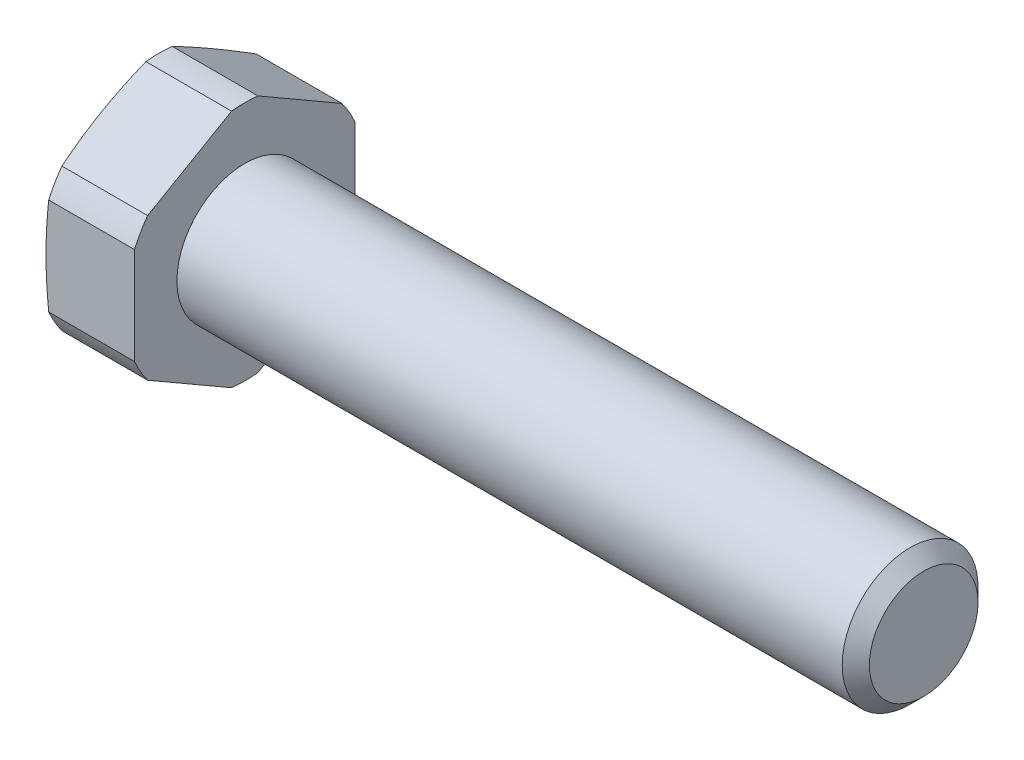
ISO-10303-21;
HEADER;
FILE_DESCRIPTION(('STEP AP214'),'2;1');
FILE_NAME('part.step','',(''),(''),'','','');
FILE_SCHEMA(('AUTOMOTIVE_DESIGN { 1 0 10303 214 1 1 1 1 }'));
ENDSEC;
DATA;
#1=APPLICATION_CONTEXT('core data for automotive mechanical design processes');
#2=APPLICATION_PROTOCOL_DEFINITION('international standard','automotive_design',2000,#1);
#3=PRODUCT_CONTEXT('',#1,'mechanical');
#4=PRODUCT('Part','Part','',(#3));
#5=PRODUCT_RELATED_PRODUCT_CATEGORY('part','',(#4));
#6=PRODUCT_DEFINITION_FORMATION('','',#4);
#7=PRODUCT_DEFINITION_CONTEXT('part definition',#1,'design');
#8=PRODUCT_DEFINITION('design','',#6,#7);
#9=PRODUCT_DEFINITION_SHAPE('','',#8);
#10=(LENGTH_UNIT() NAMED_UNIT(*) SI_UNIT(.MILLI.,.METRE.));
#11=(NAMED_UNIT(*) PLANE_ANGLE_UNIT() SI_UNIT($,.RADIAN.));
#12=(NAMED_UNIT(*) SI_UNIT($,.STERADIAN.) SOLID_ANGLE_UNIT());
#13=UNCERTAINTY_MEASURE_WITH_UNIT(LENGTH_MEASURE(1.E-05),#10,'distance_accuracy_value','');
#14=(GEOMETRIC_REPRESENTATION_CONTEXT(3) GLOBAL_UNCERTAINTY_ASSIGNED_CONTEXT((#13)) GLOBAL_UNIT_ASSIGNED_CONTEXT((#10,
#11,#12)) REPRESENTATION_CONTEXT('',''));
#15=CARTESIAN_POINT('',(0.,0.,0.));
#16=DIRECTION('',(0.,0.,1.));
#17=DIRECTION('',(1.,0.,0.));
#18=AXIS2_PLACEMENT_3D('',#15,#16,#17);
#19=CARTESIAN_POINT('',(-5.05214699700118,0.,0.));
#20=DIRECTION('',(1.,0.,0.));
#21=DIRECTION('',(0.,0.,-1.));
#22=AXIS2_PLACEMENT_3D('',#19,#20,#21);
#23=CONICAL_SURFACE('',#22,7.1,1.30899693899575);
#24=CARTESIAN_POINT('',(-5.29999999999997,0.,0.));
#25=DIRECTION('',(-1.,0.,0.));
#26=DIRECTION('',(0.,0.,1.));
#27=AXIS2_PLACEMENT_3D('',#24,#25,#26);
#28=CIRCLE('',#27,6.175);
#29=CARTESIAN_POINT('',(-5.29999999999997,0.,6.175));
#30=VERTEX_POINT('',#29);
#31=EDGE_CURVE('E139',#30,#30,#28,.T.);
#32=ORIENTED_EDGE('',*,*,#31,.F.);
#33=EDGE_LOOP('',(#32));
#34=FACE_BOUND('',#33,.T.);
#35=CARTESIAN_POINT('',(-5.05194699700118,4.19995209101869,-5.72546958900048));
#36=CARTESIAN_POINT('',(-5.07760027496928,4.31878271807594,-5.51964890544205));
#37=CARTESIAN_POINT('',(-5.10057398869207,4.43776618363352,-5.3135634978357));
#38=CARTESIAN_POINT('',(-5.14056478113438,4.67600028246681,-4.90092993456106));
#39=CARTESIAN_POINT('',(-5.1575809443837,4.79525095397189,-4.69438171267756));
#40=CARTESIAN_POINT('',(-5.18500732267828,5.0335659386847,-4.28160805094997));
#41=CARTESIAN_POINT('',(-5.19543831566365,5.15262964360177,-4.07538366469622));
#42=CARTESIAN_POINT('',(-5.20939266077495,5.39085061213871,-3.66277284376197));
#43=CARTESIAN_POINT('',(-5.21291651245986,5.51000786836884,-3.45638642188088));
#44=CARTESIAN_POINT('',(-5.21291651245985,5.74832238082911,-3.04361357811868));
#45=CARTESIAN_POINT('',(-5.20939266077494,5.86747963705925,-2.83722715623758));
#46=CARTESIAN_POINT('',(-5.19543831566363,6.10570060559619,-2.42461633530333));
#47=CARTESIAN_POINT('',(-5.18500732267826,6.22476431051326,-2.21839194904959));
#48=CARTESIAN_POINT('',(-5.15758094438367,6.46307929522607,-1.805618287322));
#49=CARTESIAN_POINT('',(-5.14056478113434,6.58232996673114,-1.5990700654385));
#50=CARTESIAN_POINT('',(-5.10057398869203,6.82056406556443,-1.18643650216385));
#51=CARTESIAN_POINT('',(-5.07760027496923,6.93954753112201,-0.980351094557503));
#52=CARTESIAN_POINT('',(-5.05194699700113,7.05837815817927,-0.774530410999076));
#53=B_SPLINE_CURVE_WITH_KNOTS('',3,(#35,#36,#37,#38,#39,#40,#41,#42,#43,#44,#45,#46,#47,#48,#49,
#50,#51,#52),.UNSPECIFIED.,.F.,.F.,(4,2,2,2,2,2,2,2,4),(0.,0.71713461947934,1.43437938951781,
2.14934960199473,2.86426810234588,3.57918660269703,4.29415681517395,5.01140158521242,
5.72853620469176),.UNSPECIFIED.);
#54=CARTESIAN_POINT('',(-5.05214699700118,4.20087943889028,-5.7238633753706));
#55=VERTEX_POINT('',#54);
#56=CARTESIAN_POINT('',(-5.05214699700118,7.05745081030742,-0.7761366246294));
#57=VERTEX_POINT('',#56);
#58=EDGE_CURVE('E211',#55,#57,#53,.T.);
#59=ORIENTED_EDGE('',*,*,#58,.F.);
#60=CARTESIAN_POINT('',(-5.05214699700118,0.,0.));
#61=DIRECTION('',(-1.,0.,0.));
#62=DIRECTION('',(0.,0.,1.));
#63=AXIS2_PLACEMENT_3D('',#60,#61,#62);
#64=CIRCLE('',#63,7.1);
#65=CARTESIAN_POINT('',(-5.05214699700118,2.85657137141714,-6.5));
#66=VERTEX_POINT('',#65);
#67=EDGE_CURVE('E294',#55,#66,#64,.T.);
#68=ORIENTED_EDGE('',*,*,#67,.T.);
#69=CARTESIAN_POINT('',(-3.77950089472168,-9.90770125370273,-6.49999999999999));
#70=CARTESIAN_POINT('',(-3.84549923221771,-9.61303683004902,-6.49999999999999));
#71=CARTESIAN_POINT('',(-3.910687083053,-9.31818755285982,-6.49999999999999));
#72=CARTESIAN_POINT('',(-4.03900435606356,-8.72802854950381,-6.49999999999999));
#73=CARTESIAN_POINT('',(-4.10213368872072,-8.43271880389633,-6.49999999999999));
#74=CARTESIAN_POINT('',(-4.22595195035626,-7.84128094408398,-6.49999999999999));
#75=CARTESIAN_POINT('',(-4.28663840023621,-7.5451523090157,-6.49999999999999));
#76=CARTESIAN_POINT('',(-4.4049126937163,-6.95227722725182,-6.49999999999999));
#77=CARTESIAN_POINT('',(-4.46250056367929,-6.65553078583486,-6.5));
#78=CARTESIAN_POINT('',(-4.57339453337854,-6.06368986807948,-6.5));
#79=CARTESIAN_POINT('',(-4.62673117435109,-5.76860114266198,-6.5));
#80=CARTESIAN_POINT('',(-4.72872616796673,-5.1776176917176,-6.5));
#81=CARTESIAN_POINT('',(-4.7773846240762,-4.88172298416536,-6.5));
#82=CARTESIAN_POINT('',(-4.86892350982985,-4.28907239039307,-6.5));
#83=CARTESIAN_POINT('',(-4.91180468331148,-3.99231662007226,-6.5));
#84=CARTESIAN_POINT('',(-4.99052177949499,-3.39786141661488,-6.5));
#85=CARTESIAN_POINT('',(-5.02635769642816,-3.10016198270582,-6.5));
#86=CARTESIAN_POINT('',(-5.08996536212492,-2.5004683432848,-6.5));
#87=CARTESIAN_POINT('',(-5.1176408530834,-2.19846377390437,-6.5));
#88=CARTESIAN_POINT('',(-5.16301575116526,-1.59369968950732,-6.5));
#89=CARTESIAN_POINT('',(-5.18071538706159,-1.29094019196317,-6.5));
#90=CARTESIAN_POINT('',(-5.20510605570838,-0.685105061534521,-6.5));
#91=CARTESIAN_POINT('',(-5.21180202439831,-0.382029631451974,-6.5));
#92=CARTESIAN_POINT('',(-5.21377415859077,0.224158974521345,-6.5));
#93=CARTESIAN_POINT('',(-5.20905033033111,0.527272150391411,-6.5));
#94=CARTESIAN_POINT('',(-5.18844845784126,1.13421773965101,-6.5));
#95=CARTESIAN_POINT('',(-5.17252981467392,1.43804874687802,-6.5));
#96=CARTESIAN_POINT('',(-5.13044490350295,2.04499361527491,-6.5));
#97=CARTESIAN_POINT('',(-5.10427841006816,2.34810746052116,-6.5));
#98=CARTESIAN_POINT('',(-5.04301462259277,2.95361619476167,-6.5));
#99=CARTESIAN_POINT('',(-5.00791153851841,3.25601048886052,-6.5));
#100=CARTESIAN_POINT('',(-4.93022920552248,3.85982662819219,-6.5));
#101=CARTESIAN_POINT('',(-4.88764993371114,4.16124847044478,-6.5));
#102=CARTESIAN_POINT('',(-4.79942061262059,4.74304526391515,-6.5));
#103=CARTESIAN_POINT('',(-4.7541658547133,5.02348076975635,-6.5));
#104=CARTESIAN_POINT('',(-4.65928179773904,5.58361433540141,-6.5));
#105=CARTESIAN_POINT('',(-4.60965238023525,5.86331237502831,-6.5));
#106=CARTESIAN_POINT('',(-4.50681836335408,6.42207301698527,-6.5));
#107=CARTESIAN_POINT('',(-4.45361344604534,6.70113556052032,-6.5));
#108=CARTESIAN_POINT('',(-4.34428024606978,7.2586887797512,-6.5));
#109=CARTESIAN_POINT('',(-4.28815192576296,7.5371794480359,-6.5));
#110=CARTESIAN_POINT('',(-4.11617513273683,8.37203815656081,-6.5));
#111=CARTESIAN_POINT('',(-3.99675790685843,8.92767029566481,-6.5));
#112=CARTESIAN_POINT('',(-3.75146990372668,10.037459547231,-6.5));
#113=CARTESIAN_POINT('',(-3.62559950106499,10.5916167433503,-6.5));
#114=CARTESIAN_POINT('',(-3.37057620947702,11.693405700181,-6.5));
#115=CARTESIAN_POINT('',(-3.24146803677519,12.2410478396252,-6.5));
#116=CARTESIAN_POINT('',(-2.98002169310475,13.3355686749825,-6.5));
#117=CARTESIAN_POINT('',(-2.84768346371383,13.8824473568975,-6.50000000000001));
#118=CARTESIAN_POINT('',(-2.58078319258935,14.9749505577544,-6.50000000000001));
#119=CARTESIAN_POINT('',(-2.44622407444428,15.5205757923582,-6.50000000000001));
#120=CARTESIAN_POINT('',(-2.1752684767797,16.611351157403,-6.50000000000001));
#121=CARTESIAN_POINT('',(-2.03887205773508,17.1565013028558,-6.50000000000001));
#122=CARTESIAN_POINT('',(-1.9018246553204,17.7014857538417,-6.50000000000001));
#123=B_SPLINE_CURVE_WITH_KNOTS('',3,(#69,#70,#71,#72,#73,#74,#75,#76,#77,#78,#79,#80,#81,#82,
#83,#84,#85,#86,#87,#88,#89,#90,#91,#92,#93,#94,#95,#96,#97,#98,#99,#100,#101,#102,#103,#104,
#105,#106,#107,#108,#109,#110,#111,#112,#113,#114,#115,#116,#117,#118,#119,#120,#121,#122),
.UNSPECIFIED.,.F.,.F.,(4,2,2,2,2,2,2,2,2,2,2,2,2,2,2,2,2,2,2,2,2,2,2,2,2,2,4),(0.,
0.905898920692892,1.81183718353167,2.71867275809954,3.62550061605085,4.52508121778624,
5.42464191911476,6.32408668917737,7.22353219570963,8.13319785926568,9.04284266091373,
9.95207930967697,10.8613154617895,11.7738661542407,12.6864369220163,13.5996004575465,
14.5127667889475,15.3649164610577,16.217089210829,17.0693378358233,17.9215974365787,
19.6264908547873,21.3312854197707,23.0192370587519,24.7072192505044,26.3931331153493,
28.0789916231747),.UNSPECIFIED.);
#124=CARTESIAN_POINT('',(-5.05214699700118,-2.85657137141715,-6.5));
#125=VERTEX_POINT('',#124);
#126=EDGE_CURVE('E190',#125,#66,#123,.T.);
#127=ORIENTED_EDGE('',*,*,#126,.F.);
#128=CARTESIAN_POINT('',(-5.05214699700118,-4.20087943889028,-5.72386337537059));
#129=VERTEX_POINT('',#128);
#130=EDGE_CURVE('E189',#125,#129,#64,.T.);
#131=ORIENTED_EDGE('',*,*,#130,.T.);
#132=CARTESIAN_POINT('',(-5.05194699700113,-7.05837815817927,-0.774530410999074));
#133=CARTESIAN_POINT('',(-5.07760027496923,-6.93954753112201,-0.980351094557501));
#134=CARTESIAN_POINT('',(-5.10057398869203,-6.82056406556443,-1.18643650216385));
#135=CARTESIAN_POINT('',(-5.14056478113434,-6.58232996673114,-1.5990700654385));
#136=CARTESIAN_POINT('',(-5.15758094438367,-6.46307929522607,-1.805618287322));
#137=CARTESIAN_POINT('',(-5.18500732267826,-6.22476431051326,-2.21839194904958));
#138=CARTESIAN_POINT('',(-5.19543831566363,-6.10570060559619,-2.42461633530333));
#139=CARTESIAN_POINT('',(-5.20939266077494,-5.86747963705925,-2.83722715623758));
#140=CARTESIAN_POINT('',(-5.21291651245985,-5.74832238082912,-3.04361357811868));
#141=CARTESIAN_POINT('',(-5.21291651245986,-5.51000786836884,-3.45638642188087));
#142=CARTESIAN_POINT('',(-5.20939266077495,-5.39085061213871,-3.66277284376197));
#143=CARTESIAN_POINT('',(-5.19543831566365,-5.15262964360177,-4.07538366469622));
#144=CARTESIAN_POINT('',(-5.18500732267828,-5.0335659386847,-4.28160805094997));
#145=CARTESIAN_POINT('',(-5.1575809443837,-4.79525095397189,-4.69438171267755));
#146=CARTESIAN_POINT('',(-5.14056478113438,-4.67600028246682,-4.90092993456105));
#147=CARTESIAN_POINT('',(-5.10057398869207,-4.43776618363352,-5.3135634978357));
#148=CARTESIAN_POINT('',(-5.07760027496928,-4.31878271807594,-5.51964890544205));
#149=CARTESIAN_POINT('',(-5.05194699700118,-4.19995209101869,-5.72546958900048));
#150=B_SPLINE_CURVE_WITH_KNOTS('',3,(#132,#133,#134,#135,#136,#137,#138,#139,#140,#141,#142,
#143,#144,#145,#146,#147,#148,#149),.UNSPECIFIED.,.F.,.F.,(4,2,2,2,2,2,2,2,4),(0.,
0.71713461947934,1.43437938951781,2.14934960199472,2.86426810234588,3.57918660269703,
4.29415681517395,5.01140158521242,5.72853620469176),.UNSPECIFIED.);
#151=CARTESIAN_POINT('',(-5.05214699700118,-7.05745081030742,-0.776136624629403));
#152=VERTEX_POINT('',#151);
#153=EDGE_CURVE('E276',#152,#129,#150,.T.);
#154=ORIENTED_EDGE('',*,*,#153,.F.);
#155=CARTESIAN_POINT('',(-5.05214699700118,-7.05745081030742,0.776136624629399));
#156=VERTEX_POINT('',#155);
#157=EDGE_CURVE('E296',#152,#156,#64,.T.);
#158=ORIENTED_EDGE('',*,*,#157,.T.);
#159=CARTESIAN_POINT('',(-5.05194699700118,-4.19995209101869,5.72546958900048));
#160=CARTESIAN_POINT('',(-5.07760027496928,-4.31878271807594,5.51964890544206));
#161=CARTESIAN_POINT('',(-5.10057398869207,-4.43776618363352,5.31356349783571));
#162=CARTESIAN_POINT('',(-5.14056478113438,-4.67600028246681,4.90092993456106));
#163=CARTESIAN_POINT('',(-5.1575809443837,-4.79525095397189,4.69438171267756));
#164=CARTESIAN_POINT('',(-5.18500732267828,-5.0335659386847,4.28160805094997));
#165=CARTESIAN_POINT('',(-5.19543831566365,-5.15262964360177,4.07538366469623));
#166=CARTESIAN_POINT('',(-5.20939266077495,-5.39085061213871,3.66277284376198));
#167=CARTESIAN_POINT('',(-5.21291651245986,-5.51000786836884,3.45638642188088));
#168=CARTESIAN_POINT('',(-5.21291651245985,-5.74832238082911,3.04361357811868));
#169=CARTESIAN_POINT('',(-5.20939266077494,-5.86747963705925,2.83722715623758));
#170=CARTESIAN_POINT('',(-5.19543831566363,-6.10570060559619,2.42461633530333));
#171=CARTESIAN_POINT('',(-5.18500732267826,-6.22476431051326,2.21839194904959));
#172=CARTESIAN_POINT('',(-5.15758094438367,-6.46307929522607,1.805618287322));
#173=CARTESIAN_POINT('',(-5.14056478113434,-6.58232996673114,1.5990700654385));
#174=CARTESIAN_POINT('',(-5.10057398869203,-6.82056406556443,1.18643650216385));
#175=CARTESIAN_POINT('',(-5.07760027496923,-6.93954753112202,0.980351094557505));
#176=CARTESIAN_POINT('',(-5.05194699700113,-7.05837815817927,0.774530410999078));
#177=B_SPLINE_CURVE_WITH_KNOTS('',3,(#159,#160,#161,#162,#163,#164,#165,#166,#167,#168,#169,
#170,#171,#172,#173,#174,#175,#176),.UNSPECIFIED.,.F.,.F.,(4,2,2,2,2,2,2,2,4),(0.,
0.71713461947934,1.43437938951781,2.14934960199472,2.86426810234588,3.57918660269703,
4.29415681517395,5.01140158521242,5.72853620469176),.UNSPECIFIED.);
#178=CARTESIAN_POINT('',(-5.05214699700118,-4.20087943889028,5.7238633753706));
#179=VERTEX_POINT('',#178);
#180=EDGE_CURVE('E265',#179,#156,#177,.T.);
#181=ORIENTED_EDGE('',*,*,#180,.F.);
#182=CARTESIAN_POINT('',(-5.05214699700118,-2.85657137141715,6.5));
#183=VERTEX_POINT('',#182);
#184=EDGE_CURVE('E157',#179,#183,#64,.T.);
#185=ORIENTED_EDGE('',*,*,#184,.T.);
#186=CARTESIAN_POINT('',(-3.77950089472168,-9.90770125370273,6.5));
#187=CARTESIAN_POINT('',(-3.84549923221771,-9.61303683004902,6.5));
#188=CARTESIAN_POINT('',(-3.910687083053,-9.31818755285982,6.5));
#189=CARTESIAN_POINT('',(-4.03900435606356,-8.72802854950381,6.5));
#190=CARTESIAN_POINT('',(-4.10213368872072,-8.43271880389633,6.5));
#191=CARTESIAN_POINT('',(-4.22595195035626,-7.84128094408398,6.5));
#192=CARTESIAN_POINT('',(-4.28663840023621,-7.5451523090157,6.5));
#193=CARTESIAN_POINT('',(-4.4049126937163,-6.95227722725182,6.5));
#194=CARTESIAN_POINT('',(-4.46250056367929,-6.65553078583486,6.5));
#195=CARTESIAN_POINT('',(-4.57339453337854,-6.06368986807948,6.5));
#196=CARTESIAN_POINT('',(-4.62673117435109,-5.76860114266199,6.5));
#197=CARTESIAN_POINT('',(-4.72872616796673,-5.1776176917176,6.5));
#198=CARTESIAN_POINT('',(-4.77738462407619,-4.88172298416536,6.5));
#199=CARTESIAN_POINT('',(-4.86892350982985,-4.28907239039307,6.5));
#200=CARTESIAN_POINT('',(-4.91180468331148,-3.99231662007226,6.5));
#201=CARTESIAN_POINT('',(-4.99052177949499,-3.39786141661487,6.5));
#202=CARTESIAN_POINT('',(-5.02635769642816,-3.10016198270582,6.5));
#203=CARTESIAN_POINT('',(-5.08996536212492,-2.5004683432848,6.5));
#204=CARTESIAN_POINT('',(-5.1176408530834,-2.19846377390436,6.5));
#205=CARTESIAN_POINT('',(-5.16301575116526,-1.59369968950732,6.5));
#206=CARTESIAN_POINT('',(-5.18071538706159,-1.29094019196316,6.5));
#207=CARTESIAN_POINT('',(-5.20510605570838,-0.685105061534517,6.5));
#208=CARTESIAN_POINT('',(-5.21180202439831,-0.382029631451971,6.5));
#209=CARTESIAN_POINT('',(-5.21377415859077,0.224158974521349,6.5));
#210=CARTESIAN_POINT('',(-5.20905033033111,0.527272150391414,6.5));
#211=CARTESIAN_POINT('',(-5.18844845784126,1.13421773965101,6.5));
#212=CARTESIAN_POINT('',(-5.17252981467392,1.43804874687802,6.5));
#213=CARTESIAN_POINT('',(-5.13044490350295,2.04499361527491,6.5));
#214=CARTESIAN_POINT('',(-5.10427841006816,2.34810746052116,6.5));
#215=CARTESIAN_POINT('',(-5.04301462259277,2.95361619476167,6.5));
#216=CARTESIAN_POINT('',(-5.00791153851841,3.25601048886052,6.5));
#217=CARTESIAN_POINT('',(-4.93022920552248,3.85982662819219,6.5));
#218=CARTESIAN_POINT('',(-4.88764993371114,4.16124847044479,6.5));
#219=CARTESIAN_POINT('',(-4.79942061262059,4.74304526391516,6.5));
#220=CARTESIAN_POINT('',(-4.7541658547133,5.02348076975635,6.5));
#221=CARTESIAN_POINT('',(-4.65928179773904,5.58361433540141,6.5));
#222=CARTESIAN_POINT('',(-4.60965238023525,5.86331237502831,6.5));
#223=CARTESIAN_POINT('',(-4.50681836335408,6.42207301698527,6.5));
#224=CARTESIAN_POINT('',(-4.45361344604534,6.70113556052032,6.5));
#225=CARTESIAN_POINT('',(-4.34428024606978,7.2586887797512,6.5));
#226=CARTESIAN_POINT('',(-4.28815192576296,7.5371794480359,6.5));
#227=CARTESIAN_POINT('',(-4.11617513273683,8.37203815656081,6.5));
#228=CARTESIAN_POINT('',(-3.99675790685843,8.92767029566482,6.49999999999999));
#229=CARTESIAN_POINT('',(-3.75146990372668,10.037459547231,6.49999999999999));
#230=CARTESIAN_POINT('',(-3.62559950106499,10.5916167433503,6.49999999999999));
#231=CARTESIAN_POINT('',(-3.37057620947702,11.693405700181,6.49999999999999));
#232=CARTESIAN_POINT('',(-3.24146803677519,12.2410478396252,6.49999999999999));
#233=CARTESIAN_POINT('',(-2.98002169310474,13.3355686749825,6.49999999999999));
#234=CARTESIAN_POINT('',(-2.84768346371383,13.8824473568975,6.49999999999999));
#235=CARTESIAN_POINT('',(-2.58078319258935,14.9749505577544,6.49999999999999));
#236=CARTESIAN_POINT('',(-2.44622407444428,15.5205757923582,6.49999999999999));
#237=CARTESIAN_POINT('',(-2.1752684767797,16.611351157403,6.49999999999999));
#238=CARTESIAN_POINT('',(-2.03887205773508,17.1565013028558,6.49999999999999));
#239=CARTESIAN_POINT('',(-1.9018246553204,17.7014857538417,6.49999999999999));
#240=B_SPLINE_CURVE_WITH_KNOTS('',3,(#186,#187,#188,#189,#190,#191,#192,#193,#194,#195,#196,
#197,#198,#199,#200,#201,#202,#203,#204,#205,#206,#207,#208,#209,#210,#211,#212,#213,#214,#215,
#216,#217,#218,#219,#220,#221,#222,#223,#224,#225,#226,#227,#228,#229,#230,#231,#232,#233,#234,
#235,#236,#237,#238,#239),.UNSPECIFIED.,.F.,.F.,(4,2,2,2,2,2,2,2,2,2,2,2,2,2,2,2,2,2,2,2,2,2,2,
2,2,2,4),(0.,0.905898920692891,1.81183718353167,2.71867275809954,3.62550061605085,
4.52508121778624,5.42464191911476,6.32408668917737,7.22353219570963,8.13319785926568,
9.04284266091373,9.95207930967697,10.8613154617895,11.7738661542407,12.6864369220163,
13.5996004575465,14.5127667889475,15.3649164610577,16.217089210829,17.0693378358233,
17.9215974365787,19.6264908547873,21.3312854197707,23.0192370587519,24.7072192505044,
26.3931331153493,28.0789916231747),.UNSPECIFIED.);
#241=CARTESIAN_POINT('',(-5.05214699700118,2.85657137141715,6.5));
#242=VERTEX_POINT('',#241);
#243=EDGE_CURVE('E248',#242,#183,#240,.F.);
#244=ORIENTED_EDGE('',*,*,#243,.F.);
#245=CARTESIAN_POINT('',(-5.05214699700118,4.20087943889028,5.72386337537059));
#246=VERTEX_POINT('',#245);
#247=EDGE_CURVE('E165',#242,#246,#64,.T.);
#248=ORIENTED_EDGE('',*,*,#247,.T.);
#249=CARTESIAN_POINT('',(-5.05194699700113,7.05837815817927,0.77453041099908));
#250=CARTESIAN_POINT('',(-5.07760027496923,6.93954753112201,0.980351094557506));
#251=CARTESIAN_POINT('',(-5.10057398869203,6.82056406556443,1.18643650216386));
#252=CARTESIAN_POINT('',(-5.14056478113434,6.58232996673114,1.5990700654385));
#253=CARTESIAN_POINT('',(-5.15758094438367,6.46307929522607,1.805618287322));
#254=CARTESIAN_POINT('',(-5.18500732267826,6.22476431051326,2.21839194904959));
#255=CARTESIAN_POINT('',(-5.19543831566363,6.10570060559619,2.42461633530333));
#256=CARTESIAN_POINT('',(-5.20939266077494,5.86747963705925,2.83722715623758));
#257=CARTESIAN_POINT('',(-5.21291651245985,5.74832238082912,3.04361357811868));
#258=CARTESIAN_POINT('',(-5.21291651245986,5.51000786836885,3.45638642188088));
#259=CARTESIAN_POINT('',(-5.20939266077495,5.39085061213871,3.66277284376197));
#260=CARTESIAN_POINT('',(-5.19543831566365,5.15262964360177,4.07538366469622));
#261=CARTESIAN_POINT('',(-5.18500732267828,5.0335659386847,4.28160805094997));
#262=CARTESIAN_POINT('',(-5.1575809443837,4.7952509539719,4.69438171267755));
#263=CARTESIAN_POINT('',(-5.14056478113438,4.67600028246682,4.90092993456105));
#264=CARTESIAN_POINT('',(-5.10057398869207,4.43776618363353,5.3135634978357));
#265=CARTESIAN_POINT('',(-5.07760027496928,4.31878271807595,5.51964890544205));
#266=CARTESIAN_POINT('',(-5.05194699700118,4.1999520910187,5.72546958900048));
#267=B_SPLINE_CURVE_WITH_KNOTS('',3,(#249,#250,#251,#252,#253,#254,#255,#256,#257,#258,#259,
#260,#261,#262,#263,#264,#265,#266),.UNSPECIFIED.,.F.,.F.,(4,2,2,2,2,2,2,2,4),(0.,
0.717134619479339,1.43437938951781,2.14934960199472,2.86426810234587,3.57918660269703,
4.29415681517394,5.01140158521241,5.72853620469175),.UNSPECIFIED.);
#268=CARTESIAN_POINT('',(-5.05214699700118,7.05745081030742,0.776136624629403));
#269=VERTEX_POINT('',#268);
#270=EDGE_CURVE('E149',#269,#246,#267,.T.);
#271=ORIENTED_EDGE('',*,*,#270,.F.);
#272=EDGE_CURVE('E148',#269,#57,#64,.T.);
#273=ORIENTED_EDGE('',*,*,#272,.T.);
#274=EDGE_LOOP('',(#59,#68,#127,#131,#154,#158,#181,#185,#244,#248,#271,#273));
#275=FACE_BOUND('',#274,.T.);
#276=ADVANCED_FACE('F40',(#34,#275),#23,.T.);
#277=CARTESIAN_POINT('',(-1000.,0.,0.));
#278=DIRECTION('',(-1.,0.,0.));
#279=DIRECTION('',(0.,0.,1.));
#280=AXIS2_PLACEMENT_3D('',#277,#278,#279);
#281=CYLINDRICAL_SURFACE('',#280,7.1);
#282=DIRECTION('',(-1.,0.,0.));
#283=VECTOR('',#282,1.);
#284=CARTESIAN_POINT('',(-1000.,4.20087943889028,-5.7238633753706));
#285=LINE('',#284,#283);
#286=CARTESIAN_POINT('',(0.,4.20087943889028,-5.7238633753706));
#287=VERTEX_POINT('',#286);
#288=EDGE_CURVE('E220',#287,#55,#285,.T.);
#289=ORIENTED_EDGE('',*,*,#288,.F.);
#290=CARTESIAN_POINT('',(0.,0.,0.));
#291=DIRECTION('',(-1.,0.,0.));
#292=DIRECTION('',(0.,0.,1.));
#293=AXIS2_PLACEMENT_3D('',#290,#291,#292);
#294=CIRCLE('',#293,7.1);
#295=CARTESIAN_POINT('',(0.,2.85657137141714,-6.5));
#296=VERTEX_POINT('',#295);
#297=EDGE_CURVE('E155',#287,#296,#294,.T.);
#298=ORIENTED_EDGE('',*,*,#297,.T.);
#299=DIRECTION('',(-1.,0.,0.));
#300=VECTOR('',#299,1.);
#301=CARTESIAN_POINT('',(-1000.,2.85657137141714,-6.5));
#302=LINE('',#301,#300);
#303=EDGE_CURVE('E181',#66,#296,#302,.F.);
#304=ORIENTED_EDGE('',*,*,#303,.F.);
#305=ORIENTED_EDGE('',*,*,#67,.F.);
#306=EDGE_LOOP('',(#289,#298,#304,#305));
#307=FACE_BOUND('',#306,.T.);
#308=ADVANCED_FACE('F295',(#307),#281,.T.);
#309=DIRECTION('',(-1.,0.,0.));
#310=VECTOR('',#309,1.);
#311=CARTESIAN_POINT('',(-1000.,7.05745081030742,-0.7761366246294));
#312=LINE('',#311,#310);
#313=CARTESIAN_POINT('',(0.,7.05745081030742,-0.776136624629407));
#314=VERTEX_POINT('',#313);
#315=EDGE_CURVE('E287',#57,#314,#312,.F.);
#316=ORIENTED_EDGE('',*,*,#315,.F.);
#317=ORIENTED_EDGE('',*,*,#272,.F.);
#318=DIRECTION('',(-1.,0.,0.));
#319=VECTOR('',#318,1.);
#320=CARTESIAN_POINT('',(-1000.,7.05745081030742,0.776136624629403));
#321=LINE('',#320,#319);
#322=CARTESIAN_POINT('',(0.,7.05745081030742,0.776136624629406));
#323=VERTEX_POINT('',#322);
#324=EDGE_CURVE('E130',#323,#269,#321,.T.);
#325=ORIENTED_EDGE('',*,*,#324,.F.);
#326=EDGE_CURVE('E146',#323,#314,#294,.T.);
#327=ORIENTED_EDGE('',*,*,#326,.T.);
#328=EDGE_LOOP('',(#316,#317,#325,#327));
#329=FACE_BOUND('',#328,.T.);
#330=ADVANCED_FACE('F145',(#329),#281,.T.);
#331=DIRECTION('',(-1.,0.,0.));
#332=VECTOR('',#331,1.);
#333=CARTESIAN_POINT('',(-1000.,-2.85657137141715,-6.5));
#334=LINE('',#333,#332);
#335=CARTESIAN_POINT('',(0.,-2.85657137141715,-6.5));
#336=VERTEX_POINT('',#335);
#337=EDGE_CURVE('E178',#336,#125,#334,.T.);
#338=ORIENTED_EDGE('',*,*,#337,.F.);
#339=CARTESIAN_POINT('',(0.,-4.20087943889028,-5.7238633753706));
#340=VERTEX_POINT('',#339);
#341=EDGE_CURVE('E160',#336,#340,#294,.T.);
#342=ORIENTED_EDGE('',*,*,#341,.T.);
#343=DIRECTION('',(-1.,0.,0.));
#344=VECTOR('',#343,1.);
#345=CARTESIAN_POINT('',(-1000.,-4.20087943889028,-5.72386337537059));
#346=LINE('',#345,#344);
#347=EDGE_CURVE('E271',#129,#340,#346,.F.);
#348=ORIENTED_EDGE('',*,*,#347,.F.);
#349=ORIENTED_EDGE('',*,*,#130,.F.);
#350=EDGE_LOOP('',(#338,#342,#348,#349));
#351=FACE_BOUND('',#350,.T.);
#352=ADVANCED_FACE('F186',(#351),#281,.T.);
#353=DIRECTION('',(-1.,0.,0.));
#354=VECTOR('',#353,1.);
#355=CARTESIAN_POINT('',(-1000.,-7.05745081030742,-0.776136624629403));
#356=LINE('',#355,#354);
#357=CARTESIAN_POINT('',(0.,-7.05745081030742,-0.776136624629398));
#358=VERTEX_POINT('',#357);
#359=EDGE_CURVE('E274',#358,#152,#356,.T.);
#360=ORIENTED_EDGE('',*,*,#359,.F.);
#361=CARTESIAN_POINT('',(0.,-7.05745081030742,0.776136624629407));
#362=VERTEX_POINT('',#361);
#363=EDGE_CURVE('E194',#358,#362,#294,.T.);
#364=ORIENTED_EDGE('',*,*,#363,.T.);
#365=DIRECTION('',(-1.,0.,0.));
#366=VECTOR('',#365,1.);
#367=CARTESIAN_POINT('',(-1000.,-7.05745081030742,0.776136624629399));
#368=LINE('',#367,#366);
#369=EDGE_CURVE('E63',#156,#362,#368,.F.);
#370=ORIENTED_EDGE('',*,*,#369,.F.);
#371=ORIENTED_EDGE('',*,*,#157,.F.);
#372=EDGE_LOOP('',(#360,#364,#370,#371));
#373=FACE_BOUND('',#372,.T.);
#374=ADVANCED_FACE('F315',(#373),#281,.T.);
#375=DIRECTION('',(-1.,0.,0.));
#376=VECTOR('',#375,1.);
#377=CARTESIAN_POINT('',(-1000.,-4.20087943889028,5.7238633753706));
#378=LINE('',#377,#376);
#379=CARTESIAN_POINT('',(0.,-4.20087943889028,5.72386337537059));
#380=VERTEX_POINT('',#379);
#381=EDGE_CURVE('E272',#380,#179,#378,.T.);
#382=ORIENTED_EDGE('',*,*,#381,.F.);
#383=CARTESIAN_POINT('',(0.,-2.85657137141714,6.5));
#384=VERTEX_POINT('',#383);
#385=EDGE_CURVE('E158',#380,#384,#294,.T.);
#386=ORIENTED_EDGE('',*,*,#385,.T.);
#387=DIRECTION('',(-1.,0.,0.));
#388=VECTOR('',#387,1.);
#389=CARTESIAN_POINT('',(-1000.,-2.85657137141715,6.5));
#390=LINE('',#389,#388);
#391=EDGE_CURVE('E55',#183,#384,#390,.F.);
#392=ORIENTED_EDGE('',*,*,#391,.F.);
#393=ORIENTED_EDGE('',*,*,#184,.F.);
#394=EDGE_LOOP('',(#382,#386,#392,#393));
#395=FACE_BOUND('',#394,.T.);
#396=ADVANCED_FACE('F305',(#395),#281,.T.);
#397=DIRECTION('',(-1.,0.,0.));
#398=VECTOR('',#397,1.);
#399=CARTESIAN_POINT('',(-1000.,2.85657137141715,6.5));
#400=LINE('',#399,#398);
#401=CARTESIAN_POINT('',(0.,2.85657137141715,6.5));
#402=VERTEX_POINT('',#401);
#403=EDGE_CURVE('E246',#402,#242,#400,.T.);
#404=ORIENTED_EDGE('',*,*,#403,.F.);
#405=CARTESIAN_POINT('',(0.,4.20087943889029,5.72386337537059));
#406=VERTEX_POINT('',#405);
#407=EDGE_CURVE('E154',#402,#406,#294,.T.);
#408=ORIENTED_EDGE('',*,*,#407,.T.);
#409=DIRECTION('',(-1.,0.,0.));
#410=VECTOR('',#409,1.);
#411=CARTESIAN_POINT('',(-1000.,4.20087943889028,5.72386337537059));
#412=LINE('',#411,#410);
#413=EDGE_CURVE('E133',#246,#406,#412,.F.);
#414=ORIENTED_EDGE('',*,*,#413,.F.);
#415=ORIENTED_EDGE('',*,*,#247,.F.);
#416=EDGE_LOOP('',(#404,#408,#414,#415));
#417=FACE_BOUND('',#416,.T.);
#418=ADVANCED_FACE('F308',(#417),#281,.T.);
#419=CARTESIAN_POINT('',(0.,7.1,0.));
#420=DIRECTION('',(-1.,0.,0.));
#421=DIRECTION('',(0.,0.,1.));
#422=AXIS2_PLACEMENT_3D('',#419,#420,#421);
#423=PLANE('',#422);
#424=CARTESIAN_POINT('',(0.,0.,0.));
#425=DIRECTION('',(-1.,0.,0.));
#426=DIRECTION('',(0.,0.,1.));
#427=AXIS2_PLACEMENT_3D('',#424,#425,#426);
#428=CIRCLE('',#427,4.);
#429=CARTESIAN_POINT('',(0.,0.,4.));
#430=VERTEX_POINT('',#429);
#431=EDGE_CURVE('E163',#430,#430,#428,.T.);
#432=ORIENTED_EDGE('',*,*,#431,.T.);
#433=EDGE_LOOP('',(#432));
#434=FACE_BOUND('',#433,.T.);
#435=DIRECTION('',(0.,-0.5,-0.866025403784439));
#436=VECTOR('',#435,1.);
#437=CARTESIAN_POINT('',(0.,7.40416512459885,-0.175609816565243));
#438=LINE('',#437,#436);
#439=EDGE_CURVE('E12',#314,#287,#438,.T.);
#440=ORIENTED_EDGE('',*,*,#439,.F.);
#441=ORIENTED_EDGE('',*,*,#326,.F.);
#442=DIRECTION('',(0.,0.5,-0.866025403784439));
#443=VECTOR('',#442,1.);
#444=CARTESIAN_POINT('',(0.,7.40416512459885,0.175609816565243));
#445=LINE('',#444,#443);
#446=EDGE_CURVE('E127',#406,#323,#445,.T.);
#447=ORIENTED_EDGE('',*,*,#446,.F.);
#448=ORIENTED_EDGE('',*,*,#407,.F.);
#449=DIRECTION('',(0.,1.,0.));
#450=VECTOR('',#449,1.);
#451=CARTESIAN_POINT('',(0.,7.1,6.5));
#452=LINE('',#451,#450);
#453=EDGE_CURVE('E138',#384,#402,#452,.T.);
#454=ORIENTED_EDGE('',*,*,#453,.F.);
#455=ORIENTED_EDGE('',*,*,#385,.F.);
#456=DIRECTION('',(0.,0.5,0.866025403784439));
#457=VECTOR('',#456,1.);
#458=CARTESIAN_POINT('',(0.,-3.85416512459885,6.32439018343476));
#459=LINE('',#458,#457);
#460=EDGE_CURVE('E171',#362,#380,#459,.T.);
#461=ORIENTED_EDGE('',*,*,#460,.F.);
#462=ORIENTED_EDGE('',*,*,#363,.F.);
#463=DIRECTION('',(0.,-0.5,0.866025403784439));
#464=VECTOR('',#463,1.);
#465=CARTESIAN_POINT('',(0.,-3.85416512459885,-6.32439018343475));
#466=LINE('',#465,#464);
#467=EDGE_CURVE('E173',#340,#358,#466,.T.);
#468=ORIENTED_EDGE('',*,*,#467,.F.);
#469=ORIENTED_EDGE('',*,*,#341,.F.);
#470=DIRECTION('',(0.,-1.,0.));
#471=VECTOR('',#470,1.);
#472=CARTESIAN_POINT('',(0.,7.1,-6.5));
#473=LINE('',#472,#471);
#474=EDGE_CURVE('E48',#296,#336,#473,.T.);
#475=ORIENTED_EDGE('',*,*,#474,.F.);
#476=ORIENTED_EDGE('',*,*,#297,.F.);
#477=EDGE_LOOP('',(#440,#441,#447,#448,#454,#455,#461,#462,#468,#469,#475,#476));
#478=FACE_BOUND('',#477,.T.);
#479=ADVANCED_FACE('F152',(#434,#478),#423,.F.);
#480=CARTESIAN_POINT('',(-5.29999999999999,0.,0.));
#481=DIRECTION('',(1.,0.,0.));
#482=DIRECTION('',(0.,0.,-1.));
#483=AXIS2_PLACEMENT_3D('',#480,#481,#482);
#484=PLANE('',#483);
#485=ORIENTED_EDGE('',*,*,#31,.T.);
#486=EDGE_LOOP('',(#485));
#487=FACE_BOUND('',#486,.T.);
#488=ADVANCED_FACE('F42',(#487),#484,.F.);
#489=CARTESIAN_POINT('',(-1000.,0.,0.));
#490=DIRECTION('',(-1.,0.,0.));
#491=DIRECTION('',(0.,0.,1.));
#492=AXIS2_PLACEMENT_3D('',#489,#490,#491);
#493=CYLINDRICAL_SURFACE('',#492,4.);
#494=ORIENTED_EDGE('',*,*,#431,.F.);
#495=EDGE_LOOP('',(#494));
#496=FACE_BOUND('',#495,.T.);
#497=CARTESIAN_POINT('',(39.1999999999999,0.,0.));
#498=DIRECTION('',(-1.,0.,0.));
#499=DIRECTION('',(0.,0.,1.));
#500=AXIS2_PLACEMENT_3D('',#497,#498,#499);
#501=CIRCLE('',#500,4.);
#502=CARTESIAN_POINT('',(39.1999999999999,0.,4.));
#503=VERTEX_POINT('',#502);
#504=EDGE_CURVE('E203',#503,#503,#501,.T.);
#505=ORIENTED_EDGE('',*,*,#504,.T.);
#506=EDGE_LOOP('',(#505));
#507=FACE_BOUND('',#506,.T.);
#508=ADVANCED_FACE('F324',(#496,#507),#493,.T.);
#509=CARTESIAN_POINT('',(40.,0.,0.));
#510=DIRECTION('',(-1.,0.,0.));
#511=DIRECTION('',(0.,0.,1.));
#512=AXIS2_PLACEMENT_3D('',#509,#510,#511);
#513=CONICAL_SURFACE('',#512,3.2,0.785398163397362);
#514=ORIENTED_EDGE('',*,*,#504,.F.);
#515=EDGE_LOOP('',(#514));
#516=FACE_BOUND('',#515,.T.);
#517=CARTESIAN_POINT('',(40.,0.,0.));
#518=DIRECTION('',(-1.,0.,0.));
#519=DIRECTION('',(0.,0.,1.));
#520=AXIS2_PLACEMENT_3D('',#517,#518,#519);
#521=CIRCLE('',#520,3.2);
#522=CARTESIAN_POINT('',(40.,0.,3.2));
#523=VERTEX_POINT('',#522);
#524=EDGE_CURVE('E207',#523,#523,#521,.T.);
#525=ORIENTED_EDGE('',*,*,#524,.T.);
#526=EDGE_LOOP('',(#525));
#527=FACE_BOUND('',#526,.T.);
#528=ADVANCED_FACE('F328',(#516,#527),#513,.T.);
#529=CARTESIAN_POINT('',(40.,3.2,0.));
#530=DIRECTION('',(-1.,0.,0.));
#531=DIRECTION('',(0.,0.,1.));
#532=AXIS2_PLACEMENT_3D('',#529,#530,#531);
#533=PLANE('',#532);
#534=ORIENTED_EDGE('',*,*,#524,.F.);
#535=EDGE_LOOP('',(#534));
#536=FACE_BOUND('',#535,.T.);
#537=ADVANCED_FACE('F236',(#536),#533,.F.);
#538=CARTESIAN_POINT('',(60.8699663951175,3.75277674973257,6.5));
#539=DIRECTION('',(0.,0.866025403784439,0.5));
#540=DIRECTION('',(0.,-0.5,0.866025403784439));
#541=AXIS2_PLACEMENT_3D('',#538,#539,#540);
#542=PLANE('',#541);
#543=ORIENTED_EDGE('',*,*,#270,.T.);
#544=ORIENTED_EDGE('',*,*,#413,.T.);
#545=ORIENTED_EDGE('',*,*,#446,.T.);
#546=ORIENTED_EDGE('',*,*,#324,.T.);
#547=EDGE_LOOP('',(#543,#544,#545,#546));
#548=FACE_BOUND('',#547,.T.);
#549=ADVANCED_FACE('F129',(#548),#542,.T.);
#550=CARTESIAN_POINT('',(60.8699663951175,-3.75277674973257,6.5));
#551=DIRECTION('',(0.,0.,1.));
#552=DIRECTION('',(0.,-1.,0.));
#553=AXIS2_PLACEMENT_3D('',#550,#551,#552);
#554=PLANE('',#553);
#555=ORIENTED_EDGE('',*,*,#243,.T.);
#556=ORIENTED_EDGE('',*,*,#391,.T.);
#557=ORIENTED_EDGE('',*,*,#453,.T.);
#558=ORIENTED_EDGE('',*,*,#403,.T.);
#559=EDGE_LOOP('',(#555,#556,#557,#558));
#560=FACE_BOUND('',#559,.T.);
#561=ADVANCED_FACE('F235',(#560),#554,.T.);
#562=CARTESIAN_POINT('',(60.8699663951175,-7.50555349946513,0.));
#563=DIRECTION('',(0.,-0.866025403784438,0.5));
#564=DIRECTION('',(0.,-0.5,-0.866025403784439));
#565=AXIS2_PLACEMENT_3D('',#562,#563,#564);
#566=PLANE('',#565);
#567=ORIENTED_EDGE('',*,*,#180,.T.);
#568=ORIENTED_EDGE('',*,*,#369,.T.);
#569=ORIENTED_EDGE('',*,*,#460,.T.);
#570=ORIENTED_EDGE('',*,*,#381,.T.);
#571=EDGE_LOOP('',(#567,#568,#569,#570));
#572=FACE_BOUND('',#571,.T.);
#573=ADVANCED_FACE('F259',(#572),#566,.T.);
#574=CARTESIAN_POINT('',(60.8699663951175,-3.75277674973257,-6.5));
#575=DIRECTION('',(0.,-0.866025403784439,-0.5));
#576=DIRECTION('',(0.,0.5,-0.866025403784439));
#577=AXIS2_PLACEMENT_3D('',#574,#575,#576);
#578=PLANE('',#577);
#579=ORIENTED_EDGE('',*,*,#153,.T.);
#580=ORIENTED_EDGE('',*,*,#347,.T.);
#581=ORIENTED_EDGE('',*,*,#467,.T.);
#582=ORIENTED_EDGE('',*,*,#359,.T.);
#583=EDGE_LOOP('',(#579,#580,#581,#582));
#584=FACE_BOUND('',#583,.T.);
#585=ADVANCED_FACE('F262',(#584),#578,.T.);
#586=CARTESIAN_POINT('',(60.8699663951175,3.75277674973257,-6.5));
#587=DIRECTION('',(0.,0.,-1.));
#588=DIRECTION('',(0.,1.,0.));
#589=AXIS2_PLACEMENT_3D('',#586,#587,#588);
#590=PLANE('',#589);
#591=ORIENTED_EDGE('',*,*,#126,.T.);
#592=ORIENTED_EDGE('',*,*,#303,.T.);
#593=ORIENTED_EDGE('',*,*,#474,.T.);
#594=ORIENTED_EDGE('',*,*,#337,.T.);
#595=EDGE_LOOP('',(#591,#592,#593,#594));
#596=FACE_BOUND('',#595,.T.);
#597=ADVANCED_FACE('F177',(#596),#590,.T.);
#598=CARTESIAN_POINT('',(60.8699663951175,7.50555349946513,0.));
#599=DIRECTION('',(0.,0.866025403784438,-0.5));
#600=DIRECTION('',(0.,0.5,0.866025403784439));
#601=AXIS2_PLACEMENT_3D('',#598,#599,#600);
#602=PLANE('',#601);
#603=ORIENTED_EDGE('',*,*,#58,.T.);
#604=ORIENTED_EDGE('',*,*,#315,.T.);
#605=ORIENTED_EDGE('',*,*,#439,.T.);
#606=ORIENTED_EDGE('',*,*,#288,.T.);
#607=EDGE_LOOP('',(#603,#604,#605,#606));
#608=FACE_BOUND('',#607,.T.);
#609=ADVANCED_FACE('F224',(#608),#602,.T.);
#610=CLOSED_SHELL('',(#276,#308,#330,#352,#374,#396,#418,#479,#488,#508,#528,#537,#549,#561,
#573,#585,#597,#609));
#611=MANIFOLD_SOLID_BREP('B2',#610);
#612=ADVANCED_BREP_SHAPE_REPRESENTATION('',(#18,#611),#14);
#613=SHAPE_DEFINITION_REPRESENTATION(#9,#612);
ENDSEC;
END-ISO-10303-21;
